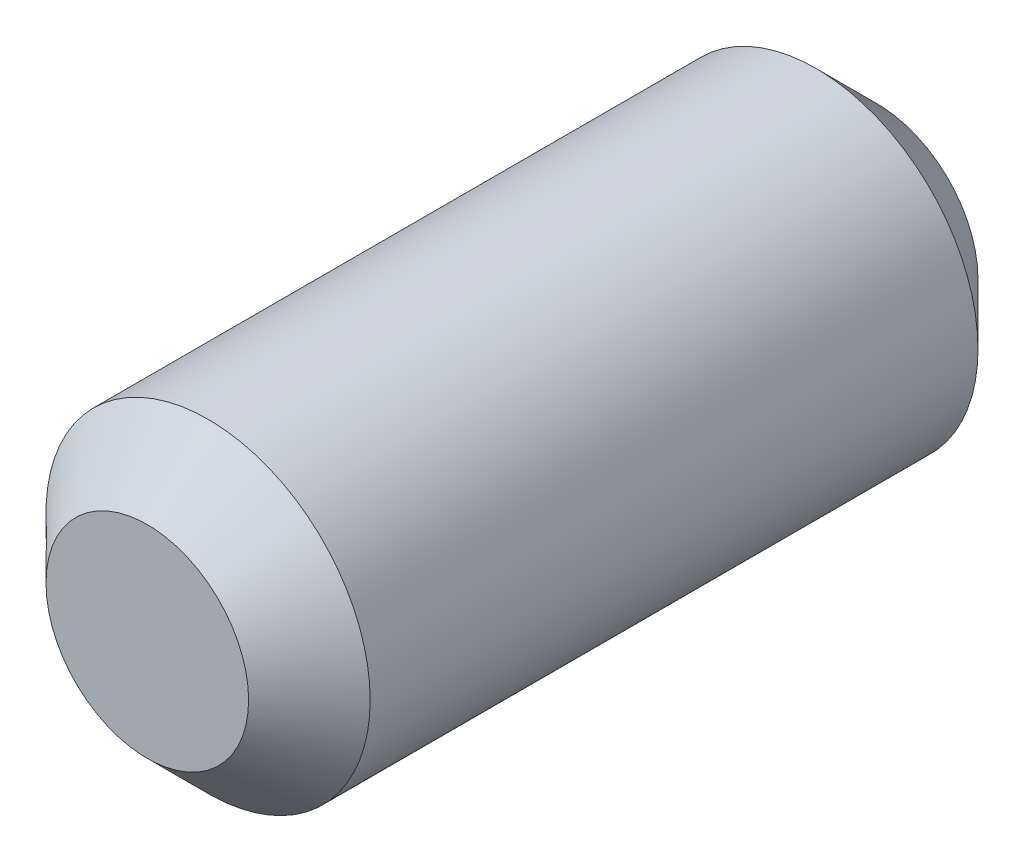
ISO-10303-21;
HEADER;
FILE_DESCRIPTION(('STEP AP214'),'2;1');
FILE_NAME('part.step','',(''),(''),'','','');
FILE_SCHEMA(('AUTOMOTIVE_DESIGN { 1 0 10303 214 1 1 1 1 }'));
ENDSEC;
DATA;
#1=APPLICATION_CONTEXT('core data for automotive mechanical design processes');
#2=APPLICATION_PROTOCOL_DEFINITION('international standard','automotive_design',2000,#1);
#3=PRODUCT_CONTEXT('',#1,'mechanical');
#4=PRODUCT('Part','Part','',(#3));
#5=PRODUCT_RELATED_PRODUCT_CATEGORY('part','',(#4));
#6=PRODUCT_DEFINITION_FORMATION('','',#4);
#7=PRODUCT_DEFINITION_CONTEXT('part definition',#1,'design');
#8=PRODUCT_DEFINITION('design','',#6,#7);
#9=PRODUCT_DEFINITION_SHAPE('','',#8);
#10=(LENGTH_UNIT() NAMED_UNIT(*) SI_UNIT(.MILLI.,.METRE.));
#11=(NAMED_UNIT(*) PLANE_ANGLE_UNIT() SI_UNIT($,.RADIAN.));
#12=(NAMED_UNIT(*) SI_UNIT($,.STERADIAN.) SOLID_ANGLE_UNIT());
#13=UNCERTAINTY_MEASURE_WITH_UNIT(LENGTH_MEASURE(1.E-05),#10,'distance_accuracy_value','');
#14=(GEOMETRIC_REPRESENTATION_CONTEXT(3) GLOBAL_UNCERTAINTY_ASSIGNED_CONTEXT((#13)) GLOBAL_UNIT_ASSIGNED_CONTEXT((#10,
#11,#12)) REPRESENTATION_CONTEXT('',''));
#15=CARTESIAN_POINT('',(0.,0.,0.));
#16=DIRECTION('',(0.,0.,1.));
#17=DIRECTION('',(1.,0.,0.));
#18=AXIS2_PLACEMENT_3D('',#15,#16,#17);
#19=CARTESIAN_POINT('',(0.,0.,18.));
#20=DIRECTION('',(0.,0.,-1.));
#21=DIRECTION('',(-1.,0.,0.));
#22=AXIS2_PLACEMENT_3D('',#19,#20,#21);
#23=CYLINDRICAL_SURFACE('',#22,4.);
#24=CARTESIAN_POINT('',(0.,0.,1.5));
#25=DIRECTION('',(0.,0.,1.));
#26=DIRECTION('',(1.,0.,0.));
#27=AXIS2_PLACEMENT_3D('',#24,#25,#26);
#28=CIRCLE('',#27,4.);
#29=CARTESIAN_POINT('',(4.,0.,1.5));
#30=VERTEX_POINT('',#29);
#31=EDGE_CURVE('E37',#30,#30,#28,.T.);
#32=ORIENTED_EDGE('',*,*,#31,.T.);
#33=EDGE_LOOP('',(#32));
#34=FACE_BOUND('',#33,.T.);
#35=CARTESIAN_POINT('',(0.,0.,16.5));
#36=DIRECTION('',(0.,0.,1.));
#37=DIRECTION('',(1.,0.,0.));
#38=AXIS2_PLACEMENT_3D('',#35,#36,#37);
#39=CIRCLE('',#38,4.);
#40=CARTESIAN_POINT('',(4.,0.,16.5));
#41=VERTEX_POINT('',#40);
#42=EDGE_CURVE('E41',#41,#41,#39,.F.);
#43=ORIENTED_EDGE('',*,*,#42,.T.);
#44=EDGE_LOOP('',(#43));
#45=FACE_BOUND('',#44,.T.);
#46=ADVANCED_FACE('F27',(#34,#45),#23,.T.);
#47=CARTESIAN_POINT('',(0.,0.,18.));
#48=DIRECTION('',(0.,0.,1.));
#49=DIRECTION('',(1.,0.,0.));
#50=AXIS2_PLACEMENT_3D('',#47,#48,#49);
#51=PLANE('',#50);
#52=CARTESIAN_POINT('',(0.,0.,18.));
#53=DIRECTION('',(0.,0.,1.));
#54=DIRECTION('',(1.,0.,0.));
#55=AXIS2_PLACEMENT_3D('',#52,#53,#54);
#56=CIRCLE('',#55,2.5);
#57=CARTESIAN_POINT('',(2.5,0.,18.));
#58=VERTEX_POINT('',#57);
#59=EDGE_CURVE('E10',#58,#58,#56,.T.);
#60=ORIENTED_EDGE('',*,*,#59,.T.);
#61=EDGE_LOOP('',(#60));
#62=FACE_BOUND('',#61,.T.);
#63=ADVANCED_FACE('F60',(#62),#51,.T.);
#64=CARTESIAN_POINT('',(0.,0.,0.));
#65=DIRECTION('',(0.,0.,1.));
#66=DIRECTION('',(1.,0.,0.));
#67=AXIS2_PLACEMENT_3D('',#64,#65,#66);
#68=PLANE('',#67);
#69=CARTESIAN_POINT('',(0.,0.,0.));
#70=DIRECTION('',(0.,0.,1.));
#71=DIRECTION('',(1.,0.,0.));
#72=AXIS2_PLACEMENT_3D('',#69,#70,#71);
#73=CIRCLE('',#72,2.49999999999999);
#74=CARTESIAN_POINT('',(2.49999999999999,0.,0.));
#75=VERTEX_POINT('',#74);
#76=EDGE_CURVE('E33',#75,#75,#73,.F.);
#77=ORIENTED_EDGE('',*,*,#76,.T.);
#78=EDGE_LOOP('',(#77));
#79=FACE_BOUND('',#78,.T.);
#80=ADVANCED_FACE('F56',(#79),#68,.F.);
#81=CARTESIAN_POINT('',(0.,0.,1.5));
#82=DIRECTION('',(0.,0.,1.));
#83=DIRECTION('',(1.,0.,0.));
#84=AXIS2_PLACEMENT_3D('',#81,#82,#83);
#85=CONICAL_SURFACE('',#84,4.,0.78539816339745);
#86=ORIENTED_EDGE('',*,*,#76,.F.);
#87=EDGE_LOOP('',(#86));
#88=FACE_BOUND('',#87,.T.);
#89=ORIENTED_EDGE('',*,*,#31,.F.);
#90=EDGE_LOOP('',(#89));
#91=FACE_BOUND('',#90,.T.);
#92=ADVANCED_FACE('F51',(#88,#91),#85,.T.);
#93=CARTESIAN_POINT('',(0.,0.,18.));
#94=DIRECTION('',(0.,0.,-1.));
#95=DIRECTION('',(-1.,0.,0.));
#96=AXIS2_PLACEMENT_3D('',#93,#94,#95);
#97=CONICAL_SURFACE('',#96,2.5,0.785398163397446);
#98=ORIENTED_EDGE('',*,*,#42,.F.);
#99=EDGE_LOOP('',(#98));
#100=FACE_BOUND('',#99,.T.);
#101=ORIENTED_EDGE('',*,*,#59,.F.);
#102=EDGE_LOOP('',(#101));
#103=FACE_BOUND('',#102,.T.);
#104=ADVANCED_FACE('F48',(#100,#103),#97,.T.);
#105=CLOSED_SHELL('',(#46,#63,#80,#92,#104));
#106=MANIFOLD_SOLID_BREP('B2',#105);
#107=ADVANCED_BREP_SHAPE_REPRESENTATION('',(#18,#106),#14);
#108=SHAPE_DEFINITION_REPRESENTATION(#9,#107);
ENDSEC;
END-ISO-10303-21;
